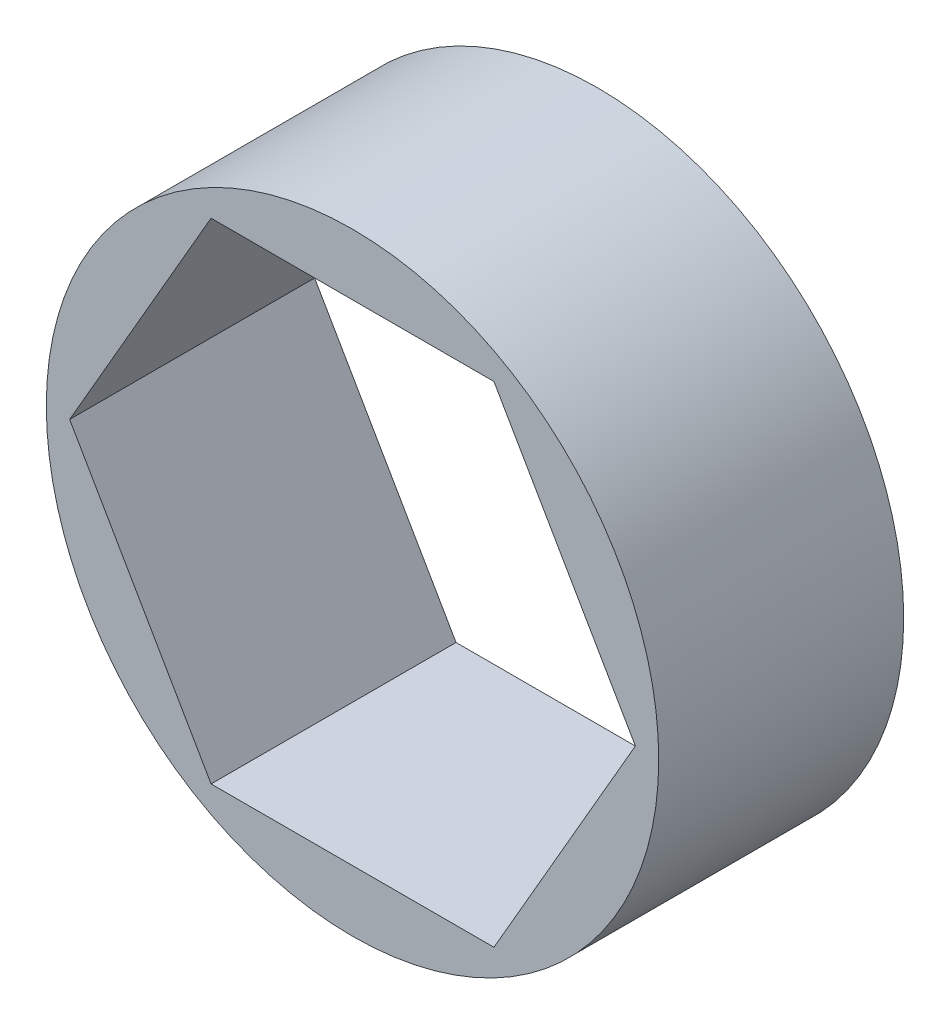
ISO-10303-21;
HEADER;
FILE_DESCRIPTION(('STEP AP214'),'2;1');
FILE_NAME('part.step','',(''),(''),'','','');
FILE_SCHEMA(('AUTOMOTIVE_DESIGN { 1 0 10303 214 1 1 1 1 }'));
ENDSEC;
DATA;
#1=APPLICATION_CONTEXT('core data for automotive mechanical design processes');
#2=APPLICATION_PROTOCOL_DEFINITION('international standard','automotive_design',2000,#1);
#3=PRODUCT_CONTEXT('',#1,'mechanical');
#4=PRODUCT('Part','Part','',(#3));
#5=PRODUCT_RELATED_PRODUCT_CATEGORY('part','',(#4));
#6=PRODUCT_DEFINITION_FORMATION('','',#4);
#7=PRODUCT_DEFINITION_CONTEXT('part definition',#1,'design');
#8=PRODUCT_DEFINITION('design','',#6,#7);
#9=PRODUCT_DEFINITION_SHAPE('','',#8);
#10=(LENGTH_UNIT() NAMED_UNIT(*) SI_UNIT(.MILLI.,.METRE.));
#11=(NAMED_UNIT(*) PLANE_ANGLE_UNIT() SI_UNIT($,.RADIAN.));
#12=(NAMED_UNIT(*) SI_UNIT($,.STERADIAN.) SOLID_ANGLE_UNIT());
#13=UNCERTAINTY_MEASURE_WITH_UNIT(LENGTH_MEASURE(1.E-05),#10,'distance_accuracy_value','');
#14=(GEOMETRIC_REPRESENTATION_CONTEXT(3) GLOBAL_UNCERTAINTY_ASSIGNED_CONTEXT((#13)) GLOBAL_UNIT_ASSIGNED_CONTEXT((#10,
#11,#12)) REPRESENTATION_CONTEXT('',''));
#15=CARTESIAN_POINT('',(0.,0.,0.));
#16=DIRECTION('',(0.,0.,1.));
#17=DIRECTION('',(1.,0.,0.));
#18=AXIS2_PLACEMENT_3D('',#15,#16,#17);
#19=CARTESIAN_POINT('',(0.,0.,6.35));
#20=DIRECTION('',(0.,0.,1.));
#21=DIRECTION('',(1.,0.,0.));
#22=AXIS2_PLACEMENT_3D('',#19,#20,#21);
#23=PLANE('',#22);
#24=CARTESIAN_POINT('',(0.,0.,6.35));
#25=DIRECTION('',(0.,0.,1.));
#26=DIRECTION('',(1.,0.,0.));
#27=AXIS2_PLACEMENT_3D('',#24,#25,#26);
#28=CIRCLE('',#27,7.9375);
#29=CARTESIAN_POINT('',(7.9375,0.,6.35));
#30=VERTEX_POINT('',#29);
#31=EDGE_CURVE('E11',#30,#30,#28,.T.);
#32=ORIENTED_EDGE('',*,*,#31,.T.);
#33=EDGE_LOOP('',(#32));
#34=FACE_BOUND('',#33,.T.);
#35=DIRECTION('',(1.,0.,0.));
#36=VECTOR('',#35,1.);
#37=CARTESIAN_POINT('',(-3.66617420935412,-6.35,6.35));
#38=LINE('',#37,#36);
#39=CARTESIAN_POINT('',(-3.66617420935412,-6.35,6.35));
#40=VERTEX_POINT('',#39);
#41=CARTESIAN_POINT('',(3.66617420935412,-6.35,6.35));
#42=VERTEX_POINT('',#41);
#43=EDGE_CURVE('E94',#40,#42,#38,.T.);
#44=ORIENTED_EDGE('',*,*,#43,.F.);
#45=DIRECTION('',(0.5,-0.866025403784438,0.));
#46=VECTOR('',#45,1.);
#47=CARTESIAN_POINT('',(-7.33234841870825,0.,6.35));
#48=LINE('',#47,#46);
#49=CARTESIAN_POINT('',(-7.33234841870825,0.,6.35));
#50=VERTEX_POINT('',#49);
#51=EDGE_CURVE('E86',#50,#40,#48,.T.);
#52=ORIENTED_EDGE('',*,*,#51,.F.);
#53=DIRECTION('',(-0.5,-0.866025403784439,0.));
#54=VECTOR('',#53,1.);
#55=CARTESIAN_POINT('',(-3.66617420935412,6.35,6.35));
#56=LINE('',#55,#54);
#57=CARTESIAN_POINT('',(-3.66617420935412,6.35,6.35));
#58=VERTEX_POINT('',#57);
#59=EDGE_CURVE('E114',#58,#50,#56,.T.);
#60=ORIENTED_EDGE('',*,*,#59,.F.);
#61=DIRECTION('',(-1.,0.,0.));
#62=VECTOR('',#61,1.);
#63=CARTESIAN_POINT('',(3.66617420935412,6.35,6.35));
#64=LINE('',#63,#62);
#65=CARTESIAN_POINT('',(3.66617420935412,6.35,6.35));
#66=VERTEX_POINT('',#65);
#67=EDGE_CURVE('E112',#66,#58,#64,.T.);
#68=ORIENTED_EDGE('',*,*,#67,.F.);
#69=DIRECTION('',(-0.5,0.866025403784438,0.));
#70=VECTOR('',#69,1.);
#71=CARTESIAN_POINT('',(7.33234841870824,0.,6.35));
#72=LINE('',#71,#70);
#73=CARTESIAN_POINT('',(7.33234841870824,0.,6.35));
#74=VERTEX_POINT('',#73);
#75=EDGE_CURVE('E108',#74,#66,#72,.T.);
#76=ORIENTED_EDGE('',*,*,#75,.F.);
#77=DIRECTION('',(0.5,0.866025403784439,0.));
#78=VECTOR('',#77,1.);
#79=CARTESIAN_POINT('',(3.66617420935412,-6.35,6.35));
#80=LINE('',#79,#78);
#81=EDGE_CURVE('E106',#42,#74,#80,.T.);
#82=ORIENTED_EDGE('',*,*,#81,.F.);
#83=EDGE_LOOP('',(#44,#52,#60,#68,#76,#82));
#84=FACE_BOUND('',#83,.T.);
#85=ADVANCED_FACE('F33',(#34,#84),#23,.T.);
#86=CARTESIAN_POINT('',(0.,0.,0.));
#87=DIRECTION('',(0.,0.,1.));
#88=DIRECTION('',(1.,0.,0.));
#89=AXIS2_PLACEMENT_3D('',#86,#87,#88);
#90=PLANE('',#89);
#91=CARTESIAN_POINT('',(0.,0.,0.));
#92=DIRECTION('',(0.,0.,1.));
#93=DIRECTION('',(1.,0.,0.));
#94=AXIS2_PLACEMENT_3D('',#91,#92,#93);
#95=CIRCLE('',#94,7.9375);
#96=CARTESIAN_POINT('',(7.9375,0.,0.));
#97=VERTEX_POINT('',#96);
#98=EDGE_CURVE('E37',#97,#97,#95,.T.);
#99=ORIENTED_EDGE('',*,*,#98,.F.);
#100=EDGE_LOOP('',(#99));
#101=FACE_BOUND('',#100,.T.);
#102=DIRECTION('',(0.5,-0.866025403784438,0.));
#103=VECTOR('',#102,1.);
#104=CARTESIAN_POINT('',(-7.33234841870825,0.,0.));
#105=LINE('',#104,#103);
#106=CARTESIAN_POINT('',(-7.33234841870825,0.,0.));
#107=VERTEX_POINT('',#106);
#108=CARTESIAN_POINT('',(-3.66617420935412,-6.35,0.));
#109=VERTEX_POINT('',#108);
#110=EDGE_CURVE('E56',#107,#109,#105,.T.);
#111=ORIENTED_EDGE('',*,*,#110,.T.);
#112=DIRECTION('',(1.,0.,0.));
#113=VECTOR('',#112,1.);
#114=CARTESIAN_POINT('',(-3.66617420935412,-6.35,0.));
#115=LINE('',#114,#113);
#116=CARTESIAN_POINT('',(3.66617420935412,-6.35,0.));
#117=VERTEX_POINT('',#116);
#118=EDGE_CURVE('E101',#109,#117,#115,.T.);
#119=ORIENTED_EDGE('',*,*,#118,.T.);
#120=DIRECTION('',(0.5,0.866025403784439,0.));
#121=VECTOR('',#120,1.);
#122=CARTESIAN_POINT('',(3.66617420935412,-6.35,0.));
#123=LINE('',#122,#121);
#124=CARTESIAN_POINT('',(7.33234841870824,0.,0.));
#125=VERTEX_POINT('',#124);
#126=EDGE_CURVE('E118',#117,#125,#123,.T.);
#127=ORIENTED_EDGE('',*,*,#126,.T.);
#128=DIRECTION('',(-0.5,0.866025403784438,0.));
#129=VECTOR('',#128,1.);
#130=CARTESIAN_POINT('',(7.33234841870824,0.,0.));
#131=LINE('',#130,#129);
#132=CARTESIAN_POINT('',(3.66617420935412,6.35,0.));
#133=VERTEX_POINT('',#132);
#134=EDGE_CURVE('E121',#125,#133,#131,.T.);
#135=ORIENTED_EDGE('',*,*,#134,.T.);
#136=DIRECTION('',(-1.,0.,0.));
#137=VECTOR('',#136,1.);
#138=CARTESIAN_POINT('',(3.66617420935412,6.35,0.));
#139=LINE('',#138,#137);
#140=CARTESIAN_POINT('',(-3.66617420935412,6.35,0.));
#141=VERTEX_POINT('',#140);
#142=EDGE_CURVE('E124',#133,#141,#139,.T.);
#143=ORIENTED_EDGE('',*,*,#142,.T.);
#144=DIRECTION('',(-0.5,-0.866025403784439,0.));
#145=VECTOR('',#144,1.);
#146=CARTESIAN_POINT('',(-3.66617420935412,6.35,0.));
#147=LINE('',#146,#145);
#148=EDGE_CURVE('E95',#141,#107,#147,.T.);
#149=ORIENTED_EDGE('',*,*,#148,.T.);
#150=EDGE_LOOP('',(#111,#119,#127,#135,#143,#149));
#151=FACE_BOUND('',#150,.T.);
#152=ADVANCED_FACE('F141',(#101,#151),#90,.F.);
#153=CARTESIAN_POINT('',(0.,0.,6.35));
#154=DIRECTION('',(0.,0.,-1.));
#155=DIRECTION('',(-1.,0.,0.));
#156=AXIS2_PLACEMENT_3D('',#153,#154,#155);
#157=CYLINDRICAL_SURFACE('',#156,7.9375);
#158=ORIENTED_EDGE('',*,*,#31,.F.);
#159=EDGE_LOOP('',(#158));
#160=FACE_BOUND('',#159,.T.);
#161=ORIENTED_EDGE('',*,*,#98,.T.);
#162=EDGE_LOOP('',(#161));
#163=FACE_BOUND('',#162,.T.);
#164=ADVANCED_FACE('F35',(#160,#163),#157,.T.);
#165=CARTESIAN_POINT('',(-7.33234841870825,0.,6.35));
#166=DIRECTION('',(0.866025403784439,0.5,0.));
#167=DIRECTION('',(-0.5,0.866025403784439,0.));
#168=AXIS2_PLACEMENT_3D('',#165,#166,#167);
#169=PLANE('',#168);
#170=ORIENTED_EDGE('',*,*,#110,.F.);
#171=DIRECTION('',(0.,0.,-1.));
#172=VECTOR('',#171,1.);
#173=CARTESIAN_POINT('',(-7.33234841870825,0.,6.35));
#174=LINE('',#173,#172);
#175=EDGE_CURVE('E90',#50,#107,#174,.T.);
#176=ORIENTED_EDGE('',*,*,#175,.F.);
#177=ORIENTED_EDGE('',*,*,#51,.T.);
#178=DIRECTION('',(0.,0.,-1.));
#179=VECTOR('',#178,1.);
#180=CARTESIAN_POINT('',(-3.66617420935412,-6.35,6.35));
#181=LINE('',#180,#179);
#182=EDGE_CURVE('E89',#40,#109,#181,.T.);
#183=ORIENTED_EDGE('',*,*,#182,.T.);
#184=EDGE_LOOP('',(#170,#176,#177,#183));
#185=FACE_BOUND('',#184,.T.);
#186=ADVANCED_FACE('F88',(#185),#169,.T.);
#187=CARTESIAN_POINT('',(-3.66617420935412,-6.35,6.35));
#188=DIRECTION('',(0.,1.,0.));
#189=DIRECTION('',(-1.,0.,0.));
#190=AXIS2_PLACEMENT_3D('',#187,#188,#189);
#191=PLANE('',#190);
#192=ORIENTED_EDGE('',*,*,#118,.F.);
#193=ORIENTED_EDGE('',*,*,#182,.F.);
#194=ORIENTED_EDGE('',*,*,#43,.T.);
#195=DIRECTION('',(0.,0.,-1.));
#196=VECTOR('',#195,1.);
#197=CARTESIAN_POINT('',(3.66617420935412,-6.35,6.35));
#198=LINE('',#197,#196);
#199=EDGE_CURVE('E102',#42,#117,#198,.T.);
#200=ORIENTED_EDGE('',*,*,#199,.T.);
#201=EDGE_LOOP('',(#192,#193,#194,#200));
#202=FACE_BOUND('',#201,.T.);
#203=ADVANCED_FACE('F98',(#202),#191,.T.);
#204=CARTESIAN_POINT('',(3.66617420935412,-6.35,6.35));
#205=DIRECTION('',(-0.866025403784439,0.5,0.));
#206=DIRECTION('',(-0.5,-0.866025403784439,0.));
#207=AXIS2_PLACEMENT_3D('',#204,#205,#206);
#208=PLANE('',#207);
#209=ORIENTED_EDGE('',*,*,#126,.F.);
#210=ORIENTED_EDGE('',*,*,#199,.F.);
#211=ORIENTED_EDGE('',*,*,#81,.T.);
#212=DIRECTION('',(0.,0.,-1.));
#213=VECTOR('',#212,1.);
#214=CARTESIAN_POINT('',(7.33234841870824,0.,6.35));
#215=LINE('',#214,#213);
#216=EDGE_CURVE('E133',#74,#125,#215,.T.);
#217=ORIENTED_EDGE('',*,*,#216,.T.);
#218=EDGE_LOOP('',(#209,#210,#211,#217));
#219=FACE_BOUND('',#218,.T.);
#220=ADVANCED_FACE('F137',(#219),#208,.T.);
#221=CARTESIAN_POINT('',(7.33234841870824,0.,6.35));
#222=DIRECTION('',(-0.866025403784438,-0.5,0.));
#223=DIRECTION('',(0.500000000000001,-0.866025403784438,0.));
#224=AXIS2_PLACEMENT_3D('',#221,#222,#223);
#225=PLANE('',#224);
#226=ORIENTED_EDGE('',*,*,#134,.F.);
#227=ORIENTED_EDGE('',*,*,#216,.F.);
#228=ORIENTED_EDGE('',*,*,#75,.T.);
#229=DIRECTION('',(0.,0.,-1.));
#230=VECTOR('',#229,1.);
#231=CARTESIAN_POINT('',(3.66617420935412,6.35,6.35));
#232=LINE('',#231,#230);
#233=EDGE_CURVE('E131',#66,#133,#232,.T.);
#234=ORIENTED_EDGE('',*,*,#233,.T.);
#235=EDGE_LOOP('',(#226,#227,#228,#234));
#236=FACE_BOUND('',#235,.T.);
#237=ADVANCED_FACE('F149',(#236),#225,.T.);
#238=CARTESIAN_POINT('',(3.66617420935412,6.35,6.35));
#239=DIRECTION('',(0.,-1.,0.));
#240=DIRECTION('',(1.,0.,0.));
#241=AXIS2_PLACEMENT_3D('',#238,#239,#240);
#242=PLANE('',#241);
#243=ORIENTED_EDGE('',*,*,#142,.F.);
#244=ORIENTED_EDGE('',*,*,#233,.F.);
#245=ORIENTED_EDGE('',*,*,#67,.T.);
#246=DIRECTION('',(0.,0.,-1.));
#247=VECTOR('',#246,1.);
#248=CARTESIAN_POINT('',(-3.66617420935412,6.35,6.35));
#249=LINE('',#248,#247);
#250=EDGE_CURVE('E48',#58,#141,#249,.T.);
#251=ORIENTED_EDGE('',*,*,#250,.T.);
#252=EDGE_LOOP('',(#243,#244,#245,#251));
#253=FACE_BOUND('',#252,.T.);
#254=ADVANCED_FACE('F147',(#253),#242,.T.);
#255=CARTESIAN_POINT('',(-3.66617420935412,6.35,6.35));
#256=DIRECTION('',(0.866025403784439,-0.5,0.));
#257=DIRECTION('',(0.5,0.866025403784439,0.));
#258=AXIS2_PLACEMENT_3D('',#255,#256,#257);
#259=PLANE('',#258);
#260=ORIENTED_EDGE('',*,*,#148,.F.);
#261=ORIENTED_EDGE('',*,*,#250,.F.);
#262=ORIENTED_EDGE('',*,*,#59,.T.);
#263=ORIENTED_EDGE('',*,*,#175,.T.);
#264=EDGE_LOOP('',(#260,#261,#262,#263));
#265=FACE_BOUND('',#264,.T.);
#266=ADVANCED_FACE('F143',(#265),#259,.T.);
#267=CLOSED_SHELL('',(#85,#152,#164,#186,#203,#220,#237,#254,#266));
#268=MANIFOLD_SOLID_BREP('B2',#267);
#269=ADVANCED_BREP_SHAPE_REPRESENTATION('',(#18,#268),#14);
#270=SHAPE_DEFINITION_REPRESENTATION(#9,#269);
ENDSEC;
END-ISO-10303-21;
